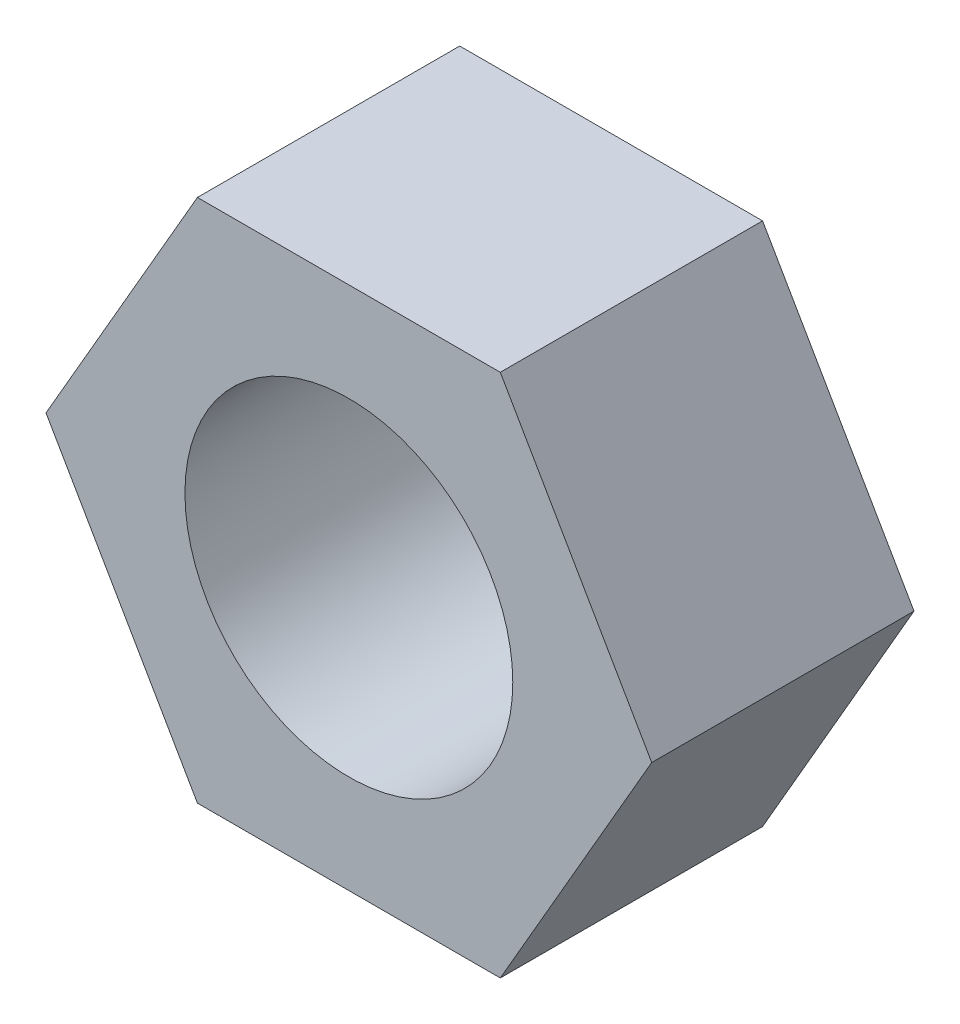
ISO-10303-21;
HEADER;
FILE_DESCRIPTION(('STEP AP214'),'2;1');
FILE_NAME('part.step','',(''),(''),'','','');
FILE_SCHEMA(('AUTOMOTIVE_DESIGN { 1 0 10303 214 1 1 1 1 }'));
ENDSEC;
DATA;
#1=APPLICATION_CONTEXT('core data for automotive mechanical design processes');
#2=APPLICATION_PROTOCOL_DEFINITION('international standard','automotive_design',2000,#1);
#3=PRODUCT_CONTEXT('',#1,'mechanical');
#4=PRODUCT('Part','Part','',(#3));
#5=PRODUCT_RELATED_PRODUCT_CATEGORY('part','',(#4));
#6=PRODUCT_DEFINITION_FORMATION('','',#4);
#7=PRODUCT_DEFINITION_CONTEXT('part definition',#1,'design');
#8=PRODUCT_DEFINITION('design','',#6,#7);
#9=PRODUCT_DEFINITION_SHAPE('','',#8);
#10=(LENGTH_UNIT() NAMED_UNIT(*) SI_UNIT(.MILLI.,.METRE.));
#11=(NAMED_UNIT(*) PLANE_ANGLE_UNIT() SI_UNIT($,.RADIAN.));
#12=(NAMED_UNIT(*) SI_UNIT($,.STERADIAN.) SOLID_ANGLE_UNIT());
#13=UNCERTAINTY_MEASURE_WITH_UNIT(LENGTH_MEASURE(1.E-05),#10,'distance_accuracy_value','');
#14=(GEOMETRIC_REPRESENTATION_CONTEXT(3) GLOBAL_UNCERTAINTY_ASSIGNED_CONTEXT((#13)) GLOBAL_UNIT_ASSIGNED_CONTEXT((#10,
#11,#12)) REPRESENTATION_CONTEXT('',''));
#15=CARTESIAN_POINT('',(0.,0.,0.));
#16=DIRECTION('',(0.,0.,1.));
#17=DIRECTION('',(1.,0.,0.));
#18=AXIS2_PLACEMENT_3D('',#15,#16,#17);
#19=CARTESIAN_POINT('',(0.,0.,4.));
#20=DIRECTION('',(0.,0.,1.));
#21=DIRECTION('',(1.,0.,0.));
#22=AXIS2_PLACEMENT_3D('',#19,#20,#21);
#23=PLANE('',#22);
#24=DIRECTION('',(0.5,0.866025403784438,0.));
#25=VECTOR('',#24,1.);
#26=CARTESIAN_POINT('',(2.3094010767585,-3.99999999999999,4.));
#27=LINE('',#26,#25);
#28=CARTESIAN_POINT('',(2.3094010767585,-3.99999999999999,4.));
#29=VERTEX_POINT('',#28);
#30=CARTESIAN_POINT('',(4.618802153517,0.,4.));
#31=VERTEX_POINT('',#30);
#32=EDGE_CURVE('E128',#29,#31,#27,.T.);
#33=ORIENTED_EDGE('',*,*,#32,.T.);
#34=DIRECTION('',(-0.500000000000002,0.866025403784438,0.));
#35=VECTOR('',#34,1.);
#36=CARTESIAN_POINT('',(4.618802153517,0.,4.));
#37=LINE('',#36,#35);
#38=CARTESIAN_POINT('',(2.30940107675849,4.00000000000001,4.));
#39=VERTEX_POINT('',#38);
#40=EDGE_CURVE('E86',#31,#39,#37,.T.);
#41=ORIENTED_EDGE('',*,*,#40,.T.);
#42=DIRECTION('',(-1.,0.,0.));
#43=VECTOR('',#42,1.);
#44=CARTESIAN_POINT('',(2.30940107675849,4.00000000000001,4.));
#45=LINE('',#44,#43);
#46=CARTESIAN_POINT('',(-2.30940107675851,4.00000000000001,4.));
#47=VERTEX_POINT('',#46);
#48=EDGE_CURVE('E99',#39,#47,#45,.T.);
#49=ORIENTED_EDGE('',*,*,#48,.T.);
#50=DIRECTION('',(-0.5,-0.866025403784438,0.));
#51=VECTOR('',#50,1.);
#52=CARTESIAN_POINT('',(-2.30940107675851,4.00000000000001,4.));
#53=LINE('',#52,#51);
#54=CARTESIAN_POINT('',(-4.61880215351702,0.,4.));
#55=VERTEX_POINT('',#54);
#56=EDGE_CURVE('E93',#47,#55,#53,.T.);
#57=ORIENTED_EDGE('',*,*,#56,.T.);
#58=DIRECTION('',(0.5,-0.866025403784439,0.));
#59=VECTOR('',#58,1.);
#60=CARTESIAN_POINT('',(-4.61880215351702,0.,4.));
#61=LINE('',#60,#59);
#62=CARTESIAN_POINT('',(-2.30940107675852,-3.99999999999999,4.));
#63=VERTEX_POINT('',#62);
#64=EDGE_CURVE('E97',#55,#63,#61,.T.);
#65=ORIENTED_EDGE('',*,*,#64,.T.);
#66=DIRECTION('',(1.,0.,0.));
#67=VECTOR('',#66,1.);
#68=CARTESIAN_POINT('',(-2.30940107675852,-3.99999999999999,4.));
#69=LINE('',#68,#67);
#70=EDGE_CURVE('E49',#63,#29,#69,.T.);
#71=ORIENTED_EDGE('',*,*,#70,.T.);
#72=EDGE_LOOP('',(#33,#41,#49,#57,#65,#71));
#73=FACE_BOUND('',#72,.T.);
#74=CARTESIAN_POINT('',(0.,0.,4.));
#75=DIRECTION('',(0.,0.,1.));
#76=DIRECTION('',(1.,0.,0.));
#77=AXIS2_PLACEMENT_3D('',#74,#75,#76);
#78=CIRCLE('',#77,2.5);
#79=CARTESIAN_POINT('',(2.5,0.,4.));
#80=VERTEX_POINT('',#79);
#81=EDGE_CURVE('E121',#80,#80,#78,.T.);
#82=ORIENTED_EDGE('',*,*,#81,.F.);
#83=EDGE_LOOP('',(#82));
#84=FACE_BOUND('',#83,.T.);
#85=ADVANCED_FACE('F32',(#73,#84),#23,.T.);
#86=CARTESIAN_POINT('',(0.,0.,0.));
#87=DIRECTION('',(0.,0.,1.));
#88=DIRECTION('',(1.,0.,0.));
#89=AXIS2_PLACEMENT_3D('',#86,#87,#88);
#90=PLANE('',#89);
#91=DIRECTION('',(0.5,0.866025403784438,0.));
#92=VECTOR('',#91,1.);
#93=CARTESIAN_POINT('',(2.3094010767585,-3.99999999999999,0.));
#94=LINE('',#93,#92);
#95=CARTESIAN_POINT('',(2.3094010767585,-3.99999999999999,0.));
#96=VERTEX_POINT('',#95);
#97=CARTESIAN_POINT('',(4.618802153517,0.,0.));
#98=VERTEX_POINT('',#97);
#99=EDGE_CURVE('E117',#96,#98,#94,.T.);
#100=ORIENTED_EDGE('',*,*,#99,.F.);
#101=DIRECTION('',(1.,0.,0.));
#102=VECTOR('',#101,1.);
#103=CARTESIAN_POINT('',(-2.30940107675852,-3.99999999999999,0.));
#104=LINE('',#103,#102);
#105=CARTESIAN_POINT('',(-2.30940107675852,-3.99999999999999,0.));
#106=VERTEX_POINT('',#105);
#107=EDGE_CURVE('E78',#106,#96,#104,.T.);
#108=ORIENTED_EDGE('',*,*,#107,.F.);
#109=DIRECTION('',(0.5,-0.866025403784439,0.));
#110=VECTOR('',#109,1.);
#111=CARTESIAN_POINT('',(-4.61880215351702,0.,0.));
#112=LINE('',#111,#110);
#113=CARTESIAN_POINT('',(-4.61880215351702,0.,0.));
#114=VERTEX_POINT('',#113);
#115=EDGE_CURVE('E72',#114,#106,#112,.T.);
#116=ORIENTED_EDGE('',*,*,#115,.F.);
#117=DIRECTION('',(-0.5,-0.866025403784438,0.));
#118=VECTOR('',#117,1.);
#119=CARTESIAN_POINT('',(-2.30940107675851,4.00000000000001,0.));
#120=LINE('',#119,#118);
#121=CARTESIAN_POINT('',(-2.30940107675851,4.00000000000001,0.));
#122=VERTEX_POINT('',#121);
#123=EDGE_CURVE('E107',#122,#114,#120,.T.);
#124=ORIENTED_EDGE('',*,*,#123,.F.);
#125=DIRECTION('',(-1.,0.,0.));
#126=VECTOR('',#125,1.);
#127=CARTESIAN_POINT('',(2.30940107675849,4.00000000000001,0.));
#128=LINE('',#127,#126);
#129=CARTESIAN_POINT('',(2.30940107675849,4.00000000000001,0.));
#130=VERTEX_POINT('',#129);
#131=EDGE_CURVE('E123',#130,#122,#128,.T.);
#132=ORIENTED_EDGE('',*,*,#131,.F.);
#133=DIRECTION('',(-0.500000000000002,0.866025403784438,0.));
#134=VECTOR('',#133,1.);
#135=CARTESIAN_POINT('',(4.618802153517,0.,0.));
#136=LINE('',#135,#134);
#137=EDGE_CURVE('E120',#98,#130,#136,.T.);
#138=ORIENTED_EDGE('',*,*,#137,.F.);
#139=EDGE_LOOP('',(#100,#108,#116,#124,#132,#138));
#140=FACE_BOUND('',#139,.T.);
#141=CARTESIAN_POINT('',(0.,0.,0.));
#142=DIRECTION('',(0.,0.,1.));
#143=DIRECTION('',(1.,0.,0.));
#144=AXIS2_PLACEMENT_3D('',#141,#142,#143);
#145=CIRCLE('',#144,2.5);
#146=CARTESIAN_POINT('',(2.5,0.,0.));
#147=VERTEX_POINT('',#146);
#148=EDGE_CURVE('E221',#147,#147,#145,.T.);
#149=ORIENTED_EDGE('',*,*,#148,.T.);
#150=EDGE_LOOP('',(#149));
#151=FACE_BOUND('',#150,.T.);
#152=ADVANCED_FACE('F137',(#140,#151),#90,.F.);
#153=CARTESIAN_POINT('',(2.3094010767585,-3.99999999999999,4.));
#154=DIRECTION('',(-0.866025403784438,0.5,0.));
#155=DIRECTION('',(-0.5,-0.866025403784439,0.));
#156=AXIS2_PLACEMENT_3D('',#153,#154,#155);
#157=PLANE('',#156);
#158=ORIENTED_EDGE('',*,*,#99,.T.);
#159=DIRECTION('',(0.,0.,-1.));
#160=VECTOR('',#159,1.);
#161=CARTESIAN_POINT('',(4.618802153517,0.,4.));
#162=LINE('',#161,#160);
#163=EDGE_CURVE('E11',#31,#98,#162,.T.);
#164=ORIENTED_EDGE('',*,*,#163,.F.);
#165=ORIENTED_EDGE('',*,*,#32,.F.);
#166=DIRECTION('',(0.,0.,-1.));
#167=VECTOR('',#166,1.);
#168=CARTESIAN_POINT('',(2.3094010767585,-3.99999999999999,4.));
#169=LINE('',#168,#167);
#170=EDGE_CURVE('E113',#29,#96,#169,.T.);
#171=ORIENTED_EDGE('',*,*,#170,.T.);
#172=EDGE_LOOP('',(#158,#164,#165,#171));
#173=FACE_BOUND('',#172,.T.);
#174=ADVANCED_FACE('F34',(#173),#157,.F.);
#175=CARTESIAN_POINT('',(4.618802153517,0.,4.));
#176=DIRECTION('',(-0.866025403784438,-0.500000000000002,0.));
#177=DIRECTION('',(0.500000000000002,-0.866025403784438,0.));
#178=AXIS2_PLACEMENT_3D('',#175,#176,#177);
#179=PLANE('',#178);
#180=ORIENTED_EDGE('',*,*,#137,.T.);
#181=DIRECTION('',(0.,0.,-1.));
#182=VECTOR('',#181,1.);
#183=CARTESIAN_POINT('',(2.30940107675849,4.00000000000001,4.));
#184=LINE('',#183,#182);
#185=EDGE_CURVE('E41',#39,#130,#184,.T.);
#186=ORIENTED_EDGE('',*,*,#185,.F.);
#187=ORIENTED_EDGE('',*,*,#40,.F.);
#188=ORIENTED_EDGE('',*,*,#163,.T.);
#189=EDGE_LOOP('',(#180,#186,#187,#188));
#190=FACE_BOUND('',#189,.T.);
#191=ADVANCED_FACE('F162',(#190),#179,.F.);
#192=CARTESIAN_POINT('',(2.30940107675849,4.00000000000001,4.));
#193=DIRECTION('',(0.,-1.,0.));
#194=DIRECTION('',(0.,0.,-1.));
#195=AXIS2_PLACEMENT_3D('',#192,#193,#194);
#196=PLANE('',#195);
#197=ORIENTED_EDGE('',*,*,#131,.T.);
#198=DIRECTION('',(0.,0.,-1.));
#199=VECTOR('',#198,1.);
#200=CARTESIAN_POINT('',(-2.30940107675851,4.00000000000001,4.));
#201=LINE('',#200,#199);
#202=EDGE_CURVE('E108',#47,#122,#201,.T.);
#203=ORIENTED_EDGE('',*,*,#202,.F.);
#204=ORIENTED_EDGE('',*,*,#48,.F.);
#205=ORIENTED_EDGE('',*,*,#185,.T.);
#206=EDGE_LOOP('',(#197,#203,#204,#205));
#207=FACE_BOUND('',#206,.T.);
#208=ADVANCED_FACE('F134',(#207),#196,.F.);
#209=CARTESIAN_POINT('',(-2.30940107675851,4.00000000000001,4.));
#210=DIRECTION('',(0.866025403784439,-0.5,0.));
#211=DIRECTION('',(0.5,0.866025403784438,0.));
#212=AXIS2_PLACEMENT_3D('',#209,#210,#211);
#213=PLANE('',#212);
#214=ORIENTED_EDGE('',*,*,#123,.T.);
#215=DIRECTION('',(0.,0.,-1.));
#216=VECTOR('',#215,1.);
#217=CARTESIAN_POINT('',(-4.61880215351702,0.,4.));
#218=LINE('',#217,#216);
#219=EDGE_CURVE('E104',#55,#114,#218,.T.);
#220=ORIENTED_EDGE('',*,*,#219,.F.);
#221=ORIENTED_EDGE('',*,*,#56,.F.);
#222=ORIENTED_EDGE('',*,*,#202,.T.);
#223=EDGE_LOOP('',(#214,#220,#221,#222));
#224=FACE_BOUND('',#223,.T.);
#225=ADVANCED_FACE('F105',(#224),#213,.F.);
#226=CARTESIAN_POINT('',(-4.61880215351702,0.,4.));
#227=DIRECTION('',(0.866025403784438,0.5,0.));
#228=DIRECTION('',(-0.5,0.866025403784439,0.));
#229=AXIS2_PLACEMENT_3D('',#226,#227,#228);
#230=PLANE('',#229);
#231=ORIENTED_EDGE('',*,*,#115,.T.);
#232=DIRECTION('',(0.,0.,-1.));
#233=VECTOR('',#232,1.);
#234=CARTESIAN_POINT('',(-2.30940107675852,-3.99999999999999,4.));
#235=LINE('',#234,#233);
#236=EDGE_CURVE('E109',#63,#106,#235,.T.);
#237=ORIENTED_EDGE('',*,*,#236,.F.);
#238=ORIENTED_EDGE('',*,*,#64,.F.);
#239=ORIENTED_EDGE('',*,*,#219,.T.);
#240=EDGE_LOOP('',(#231,#237,#238,#239));
#241=FACE_BOUND('',#240,.T.);
#242=ADVANCED_FACE('F111',(#241),#230,.F.);
#243=CARTESIAN_POINT('',(-2.30940107675852,-3.99999999999999,4.));
#244=DIRECTION('',(0.,1.,0.));
#245=DIRECTION('',(0.,0.,1.));
#246=AXIS2_PLACEMENT_3D('',#243,#244,#245);
#247=PLANE('',#246);
#248=ORIENTED_EDGE('',*,*,#107,.T.);
#249=ORIENTED_EDGE('',*,*,#170,.F.);
#250=ORIENTED_EDGE('',*,*,#70,.F.);
#251=ORIENTED_EDGE('',*,*,#236,.T.);
#252=EDGE_LOOP('',(#248,#249,#250,#251));
#253=FACE_BOUND('',#252,.T.);
#254=ADVANCED_FACE('F142',(#253),#247,.F.);
#255=CARTESIAN_POINT('',(0.,0.,4.));
#256=DIRECTION('',(0.,0.,-1.));
#257=DIRECTION('',(-1.,0.,0.));
#258=AXIS2_PLACEMENT_3D('',#255,#256,#257);
#259=CYLINDRICAL_SURFACE('',#258,2.5);
#260=ORIENTED_EDGE('',*,*,#81,.T.);
#261=EDGE_LOOP('',(#260));
#262=FACE_BOUND('',#261,.T.);
#263=ORIENTED_EDGE('',*,*,#148,.F.);
#264=EDGE_LOOP('',(#263));
#265=FACE_BOUND('',#264,.T.);
#266=ADVANCED_FACE('F144',(#262,#265),#259,.F.);
#267=CLOSED_SHELL('',(#85,#152,#174,#191,#208,#225,#242,#254,#266));
#268=MANIFOLD_SOLID_BREP('B2',#267);
#269=ADVANCED_BREP_SHAPE_REPRESENTATION('',(#18,#268),#14);
#270=SHAPE_DEFINITION_REPRESENTATION(#9,#269);
ENDSEC;
END-ISO-10303-21;
